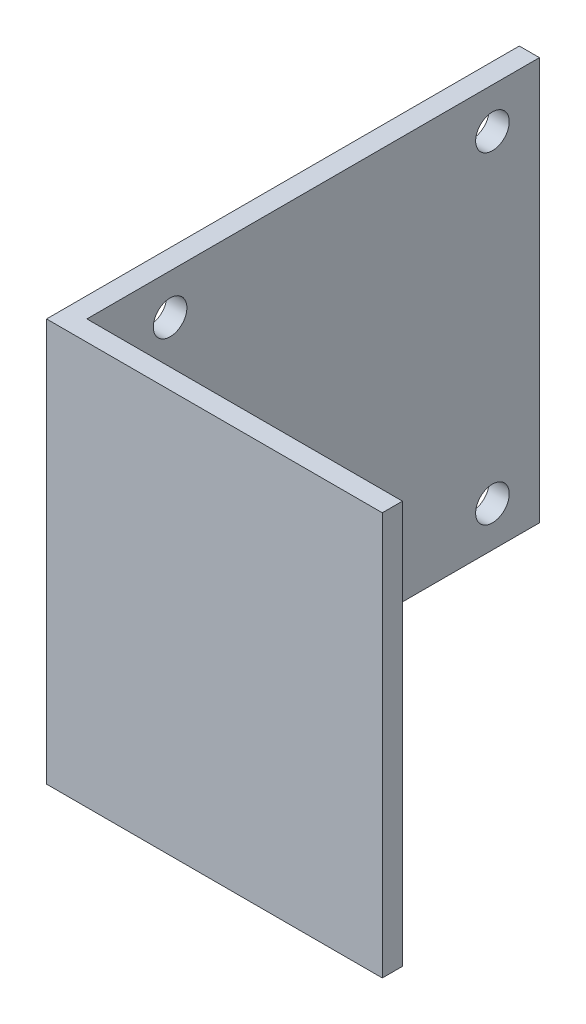
ISO-10303-21;
HEADER;
FILE_DESCRIPTION(('STEP AP214'),'2;1');
FILE_NAME('part.step','',(''),(''),'','','');
FILE_SCHEMA(('AUTOMOTIVE_DESIGN { 1 0 10303 214 1 1 1 1 }'));
ENDSEC;
DATA;
#1=APPLICATION_CONTEXT('core data for automotive mechanical design processes');
#2=APPLICATION_PROTOCOL_DEFINITION('international standard','automotive_design',2000,#1);
#3=PRODUCT_CONTEXT('',#1,'mechanical');
#4=PRODUCT('Part','Part','',(#3));
#5=PRODUCT_RELATED_PRODUCT_CATEGORY('part','',(#4));
#6=PRODUCT_DEFINITION_FORMATION('','',#4);
#7=PRODUCT_DEFINITION_CONTEXT('part definition',#1,'design');
#8=PRODUCT_DEFINITION('design','',#6,#7);
#9=PRODUCT_DEFINITION_SHAPE('','',#8);
#10=(LENGTH_UNIT() NAMED_UNIT(*) SI_UNIT(.MILLI.,.METRE.));
#11=(NAMED_UNIT(*) PLANE_ANGLE_UNIT() SI_UNIT($,.RADIAN.));
#12=(NAMED_UNIT(*) SI_UNIT($,.STERADIAN.) SOLID_ANGLE_UNIT());
#13=UNCERTAINTY_MEASURE_WITH_UNIT(LENGTH_MEASURE(1.E-05),#10,'distance_accuracy_value','');
#14=(GEOMETRIC_REPRESENTATION_CONTEXT(3) GLOBAL_UNCERTAINTY_ASSIGNED_CONTEXT((#13)) GLOBAL_UNIT_ASSIGNED_CONTEXT((#10,
#11,#12)) REPRESENTATION_CONTEXT('',''));
#15=CARTESIAN_POINT('',(0.,0.,0.));
#16=DIRECTION('',(0.,0.,1.));
#17=DIRECTION('',(1.,0.,0.));
#18=AXIS2_PLACEMENT_3D('',#15,#16,#17);
#19=CARTESIAN_POINT('',(50.,60.,0.));
#20=DIRECTION('',(0.,0.,-1.));
#21=DIRECTION('',(-1.,0.,0.));
#22=AXIS2_PLACEMENT_3D('',#19,#20,#21);
#23=PLANE('',#22);
#24=DIRECTION('',(1.,0.,0.));
#25=VECTOR('',#24,1.);
#26=CARTESIAN_POINT('',(50.,0.,0.));
#27=LINE('',#26,#25);
#28=CARTESIAN_POINT('',(0.,0.,0.));
#29=VERTEX_POINT('',#28);
#30=CARTESIAN_POINT('',(50.,0.,0.));
#31=VERTEX_POINT('',#30);
#32=EDGE_CURVE('E128',#29,#31,#27,.T.);
#33=ORIENTED_EDGE('',*,*,#32,.T.);
#34=DIRECTION('',(0.,-1.,0.));
#35=VECTOR('',#34,1.);
#36=CARTESIAN_POINT('',(50.,60.,0.));
#37=LINE('',#36,#35);
#38=CARTESIAN_POINT('',(50.,60.,0.));
#39=VERTEX_POINT('',#38);
#40=EDGE_CURVE('E11',#39,#31,#37,.T.);
#41=ORIENTED_EDGE('',*,*,#40,.F.);
#42=DIRECTION('',(1.,0.,0.));
#43=VECTOR('',#42,1.);
#44=CARTESIAN_POINT('',(50.,60.,0.));
#45=LINE('',#44,#43);
#46=CARTESIAN_POINT('',(0.,60.,0.));
#47=VERTEX_POINT('',#46);
#48=EDGE_CURVE('E145',#47,#39,#45,.T.);
#49=ORIENTED_EDGE('',*,*,#48,.F.);
#50=DIRECTION('',(0.,-1.,0.));
#51=VECTOR('',#50,1.);
#52=CARTESIAN_POINT('',(0.,60.,0.));
#53=LINE('',#52,#51);
#54=EDGE_CURVE('E124',#47,#29,#53,.T.);
#55=ORIENTED_EDGE('',*,*,#54,.T.);
#56=EDGE_LOOP('',(#33,#41,#49,#55));
#57=FACE_BOUND('',#56,.T.);
#58=ADVANCED_FACE('F39',(#57),#23,.F.);
#59=CARTESIAN_POINT('',(50.,60.,-3.));
#60=DIRECTION('',(-1.,0.,0.));
#61=DIRECTION('',(0.,0.,1.));
#62=AXIS2_PLACEMENT_3D('',#59,#60,#61);
#63=PLANE('',#62);
#64=DIRECTION('',(0.,0.,-1.));
#65=VECTOR('',#64,1.);
#66=CARTESIAN_POINT('',(50.,0.,-3.));
#67=LINE('',#66,#65);
#68=CARTESIAN_POINT('',(50.,0.,-3.));
#69=VERTEX_POINT('',#68);
#70=EDGE_CURVE('E132',#31,#69,#67,.T.);
#71=ORIENTED_EDGE('',*,*,#70,.T.);
#72=DIRECTION('',(0.,-1.,0.));
#73=VECTOR('',#72,1.);
#74=CARTESIAN_POINT('',(50.,60.,-3.));
#75=LINE('',#74,#73);
#76=CARTESIAN_POINT('',(50.,60.,-3.));
#77=VERTEX_POINT('',#76);
#78=EDGE_CURVE('E48',#77,#69,#75,.T.);
#79=ORIENTED_EDGE('',*,*,#78,.F.);
#80=DIRECTION('',(0.,0.,-1.));
#81=VECTOR('',#80,1.);
#82=CARTESIAN_POINT('',(50.,60.,-3.));
#83=LINE('',#82,#81);
#84=EDGE_CURVE('E93',#39,#77,#83,.T.);
#85=ORIENTED_EDGE('',*,*,#84,.F.);
#86=ORIENTED_EDGE('',*,*,#40,.T.);
#87=EDGE_LOOP('',(#71,#79,#85,#86));
#88=FACE_BOUND('',#87,.T.);
#89=ADVANCED_FACE('F176',(#88),#63,.F.);
#90=CARTESIAN_POINT('',(3.00000000000001,60.,-3.));
#91=DIRECTION('',(0.,0.,1.));
#92=DIRECTION('',(1.,0.,0.));
#93=AXIS2_PLACEMENT_3D('',#90,#91,#92);
#94=PLANE('',#93);
#95=DIRECTION('',(-1.,0.,0.));
#96=VECTOR('',#95,1.);
#97=CARTESIAN_POINT('',(3.00000000000001,0.,-3.));
#98=LINE('',#97,#96);
#99=CARTESIAN_POINT('',(3.00000000000001,0.,-3.));
#100=VERTEX_POINT('',#99);
#101=EDGE_CURVE('E136',#69,#100,#98,.T.);
#102=ORIENTED_EDGE('',*,*,#101,.T.);
#103=DIRECTION('',(0.,-1.,0.));
#104=VECTOR('',#103,1.);
#105=CARTESIAN_POINT('',(3.00000000000001,60.,-3.));
#106=LINE('',#105,#104);
#107=CARTESIAN_POINT('',(3.00000000000001,60.,-3.));
#108=VERTEX_POINT('',#107);
#109=EDGE_CURVE('E117',#108,#100,#106,.T.);
#110=ORIENTED_EDGE('',*,*,#109,.F.);
#111=DIRECTION('',(-1.,0.,0.));
#112=VECTOR('',#111,1.);
#113=CARTESIAN_POINT('',(3.00000000000001,60.,-3.));
#114=LINE('',#113,#112);
#115=EDGE_CURVE('E106',#77,#108,#114,.T.);
#116=ORIENTED_EDGE('',*,*,#115,.F.);
#117=ORIENTED_EDGE('',*,*,#78,.T.);
#118=EDGE_LOOP('',(#102,#110,#116,#117));
#119=FACE_BOUND('',#118,.T.);
#120=ADVANCED_FACE('F155',(#119),#94,.F.);
#121=CARTESIAN_POINT('',(3.,60.,-70.4));
#122=DIRECTION('',(-1.,0.,0.));
#123=DIRECTION('',(0.,0.,1.));
#124=AXIS2_PLACEMENT_3D('',#121,#122,#123);
#125=PLANE('',#124);
#126=CARTESIAN_POINT('',(3.,54.,-63.4));
#127=DIRECTION('',(-1.,0.,0.));
#128=DIRECTION('',(0.,0.,1.));
#129=AXIS2_PLACEMENT_3D('',#126,#127,#128);
#130=CIRCLE('',#129,2.5);
#131=CARTESIAN_POINT('',(3.,54.,-60.9));
#132=VERTEX_POINT('',#131);
#133=EDGE_CURVE('E133',#132,#132,#130,.T.);
#134=ORIENTED_EDGE('',*,*,#133,.T.);
#135=EDGE_LOOP('',(#134));
#136=FACE_BOUND('',#135,.T.);
#137=CARTESIAN_POINT('',(3.00000000000001,54.,-15.4));
#138=DIRECTION('',(-1.,0.,0.));
#139=DIRECTION('',(0.,0.,1.));
#140=AXIS2_PLACEMENT_3D('',#137,#138,#139);
#141=CIRCLE('',#140,2.5);
#142=CARTESIAN_POINT('',(3.00000000000001,54.,-12.9));
#143=VERTEX_POINT('',#142);
#144=EDGE_CURVE('E195',#143,#143,#141,.T.);
#145=ORIENTED_EDGE('',*,*,#144,.T.);
#146=EDGE_LOOP('',(#145));
#147=FACE_BOUND('',#146,.T.);
#148=CARTESIAN_POINT('',(3.00000000000001,6.,-15.4));
#149=DIRECTION('',(-1.,0.,0.));
#150=DIRECTION('',(0.,0.,1.));
#151=AXIS2_PLACEMENT_3D('',#148,#149,#150);
#152=CIRCLE('',#151,2.5);
#153=CARTESIAN_POINT('',(3.00000000000001,6.,-12.9));
#154=VERTEX_POINT('',#153);
#155=EDGE_CURVE('E199',#154,#154,#152,.T.);
#156=ORIENTED_EDGE('',*,*,#155,.T.);
#157=EDGE_LOOP('',(#156));
#158=FACE_BOUND('',#157,.T.);
#159=CARTESIAN_POINT('',(3.,6.,-63.4));
#160=DIRECTION('',(-1.,0.,0.));
#161=DIRECTION('',(0.,0.,1.));
#162=AXIS2_PLACEMENT_3D('',#159,#160,#161);
#163=CIRCLE('',#162,2.49999999999999);
#164=CARTESIAN_POINT('',(3.,6.,-60.9));
#165=VERTEX_POINT('',#164);
#166=EDGE_CURVE('E202',#165,#165,#163,.T.);
#167=ORIENTED_EDGE('',*,*,#166,.T.);
#168=EDGE_LOOP('',(#167));
#169=FACE_BOUND('',#168,.T.);
#170=DIRECTION('',(0.,0.,-1.));
#171=VECTOR('',#170,1.);
#172=CARTESIAN_POINT('',(3.,0.,-70.4));
#173=LINE('',#172,#171);
#174=CARTESIAN_POINT('',(3.,0.,-70.4));
#175=VERTEX_POINT('',#174);
#176=EDGE_CURVE('E115',#100,#175,#173,.T.);
#177=ORIENTED_EDGE('',*,*,#176,.T.);
#178=DIRECTION('',(0.,-1.,0.));
#179=VECTOR('',#178,1.);
#180=CARTESIAN_POINT('',(3.,60.,-70.4));
#181=LINE('',#180,#179);
#182=CARTESIAN_POINT('',(3.,60.,-70.4));
#183=VERTEX_POINT('',#182);
#184=EDGE_CURVE('E112',#183,#175,#181,.T.);
#185=ORIENTED_EDGE('',*,*,#184,.F.);
#186=DIRECTION('',(0.,0.,-1.));
#187=VECTOR('',#186,1.);
#188=CARTESIAN_POINT('',(3.,60.,-70.4));
#189=LINE('',#188,#187);
#190=EDGE_CURVE('E100',#108,#183,#189,.T.);
#191=ORIENTED_EDGE('',*,*,#190,.F.);
#192=ORIENTED_EDGE('',*,*,#109,.T.);
#193=EDGE_LOOP('',(#177,#185,#191,#192));
#194=FACE_BOUND('',#193,.T.);
#195=ADVANCED_FACE('F113',(#136,#147,#158,#169,#194),#125,.F.);
#196=CARTESIAN_POINT('',(0.,60.,-70.4));
#197=DIRECTION('',(0.,0.,1.));
#198=DIRECTION('',(1.,0.,0.));
#199=AXIS2_PLACEMENT_3D('',#196,#197,#198);
#200=PLANE('',#199);
#201=DIRECTION('',(-1.,0.,0.));
#202=VECTOR('',#201,1.);
#203=CARTESIAN_POINT('',(0.,0.,-70.4));
#204=LINE('',#203,#202);
#205=CARTESIAN_POINT('',(0.,0.,-70.4));
#206=VERTEX_POINT('',#205);
#207=EDGE_CURVE('E79',#175,#206,#204,.T.);
#208=ORIENTED_EDGE('',*,*,#207,.T.);
#209=DIRECTION('',(0.,-1.,0.));
#210=VECTOR('',#209,1.);
#211=CARTESIAN_POINT('',(0.,60.,-70.4));
#212=LINE('',#211,#210);
#213=CARTESIAN_POINT('',(0.,60.,-70.4));
#214=VERTEX_POINT('',#213);
#215=EDGE_CURVE('E118',#214,#206,#212,.T.);
#216=ORIENTED_EDGE('',*,*,#215,.F.);
#217=DIRECTION('',(-1.,0.,0.));
#218=VECTOR('',#217,1.);
#219=CARTESIAN_POINT('',(0.,60.,-70.4));
#220=LINE('',#219,#218);
#221=EDGE_CURVE('E104',#183,#214,#220,.T.);
#222=ORIENTED_EDGE('',*,*,#221,.F.);
#223=ORIENTED_EDGE('',*,*,#184,.T.);
#224=EDGE_LOOP('',(#208,#216,#222,#223));
#225=FACE_BOUND('',#224,.T.);
#226=ADVANCED_FACE('F120',(#225),#200,.F.);
#227=CARTESIAN_POINT('',(0.,60.,0.));
#228=DIRECTION('',(1.,0.,0.));
#229=DIRECTION('',(0.,0.,-1.));
#230=AXIS2_PLACEMENT_3D('',#227,#228,#229);
#231=PLANE('',#230);
#232=CARTESIAN_POINT('',(0.,54.,-63.4));
#233=DIRECTION('',(-1.,0.,0.));
#234=DIRECTION('',(0.,0.,-1.));
#235=AXIS2_PLACEMENT_3D('',#232,#233,#234);
#236=CIRCLE('',#235,2.5);
#237=CARTESIAN_POINT('',(0.,54.,-65.9));
#238=VERTEX_POINT('',#237);
#239=EDGE_CURVE('E223',#238,#238,#236,.T.);
#240=ORIENTED_EDGE('',*,*,#239,.F.);
#241=EDGE_LOOP('',(#240));
#242=FACE_BOUND('',#241,.T.);
#243=CARTESIAN_POINT('',(0.,54.,-15.4));
#244=DIRECTION('',(-1.,0.,0.));
#245=DIRECTION('',(0.,0.,-1.));
#246=AXIS2_PLACEMENT_3D('',#243,#244,#245);
#247=CIRCLE('',#246,2.5);
#248=CARTESIAN_POINT('',(0.,54.,-17.9));
#249=VERTEX_POINT('',#248);
#250=EDGE_CURVE('E227',#249,#249,#247,.T.);
#251=ORIENTED_EDGE('',*,*,#250,.F.);
#252=EDGE_LOOP('',(#251));
#253=FACE_BOUND('',#252,.T.);
#254=CARTESIAN_POINT('',(0.,6.,-15.4));
#255=DIRECTION('',(-1.,0.,0.));
#256=DIRECTION('',(0.,0.,1.));
#257=AXIS2_PLACEMENT_3D('',#254,#255,#256);
#258=CIRCLE('',#257,2.5);
#259=CARTESIAN_POINT('',(0.,6.,-12.9));
#260=VERTEX_POINT('',#259);
#261=EDGE_CURVE('E211',#260,#260,#258,.T.);
#262=ORIENTED_EDGE('',*,*,#261,.F.);
#263=EDGE_LOOP('',(#262));
#264=FACE_BOUND('',#263,.T.);
#265=CARTESIAN_POINT('',(0.,6.,-63.4));
#266=DIRECTION('',(-1.,0.,0.));
#267=DIRECTION('',(0.,0.,1.));
#268=AXIS2_PLACEMENT_3D('',#265,#266,#267);
#269=CIRCLE('',#268,2.49999999999999);
#270=CARTESIAN_POINT('',(0.,6.,-60.9));
#271=VERTEX_POINT('',#270);
#272=EDGE_CURVE('E205',#271,#271,#269,.T.);
#273=ORIENTED_EDGE('',*,*,#272,.F.);
#274=EDGE_LOOP('',(#273));
#275=FACE_BOUND('',#274,.T.);
#276=DIRECTION('',(0.,0.,1.));
#277=VECTOR('',#276,1.);
#278=CARTESIAN_POINT('',(0.,0.,0.));
#279=LINE('',#278,#277);
#280=EDGE_CURVE('E85',#206,#29,#279,.T.);
#281=ORIENTED_EDGE('',*,*,#280,.T.);
#282=ORIENTED_EDGE('',*,*,#54,.F.);
#283=DIRECTION('',(0.,0.,1.));
#284=VECTOR('',#283,1.);
#285=CARTESIAN_POINT('',(0.,60.,0.));
#286=LINE('',#285,#284);
#287=EDGE_CURVE('E56',#214,#47,#286,.T.);
#288=ORIENTED_EDGE('',*,*,#287,.F.);
#289=ORIENTED_EDGE('',*,*,#215,.T.);
#290=EDGE_LOOP('',(#281,#282,#288,#289));
#291=FACE_BOUND('',#290,.T.);
#292=ADVANCED_FACE('F162',(#242,#253,#264,#275,#291),#231,.F.);
#293=CARTESIAN_POINT('',(0.,60.,0.));
#294=DIRECTION('',(0.,-1.,0.));
#295=DIRECTION('',(0.,0.,-1.));
#296=AXIS2_PLACEMENT_3D('',#293,#294,#295);
#297=PLANE('',#296);
#298=ORIENTED_EDGE('',*,*,#48,.T.);
#299=ORIENTED_EDGE('',*,*,#84,.T.);
#300=ORIENTED_EDGE('',*,*,#115,.T.);
#301=ORIENTED_EDGE('',*,*,#190,.T.);
#302=ORIENTED_EDGE('',*,*,#221,.T.);
#303=ORIENTED_EDGE('',*,*,#287,.T.);
#304=EDGE_LOOP('',(#298,#299,#300,#301,#302,#303));
#305=FACE_BOUND('',#304,.T.);
#306=ADVANCED_FACE('F102',(#305),#297,.F.);
#307=CARTESIAN_POINT('',(0.,0.,0.));
#308=DIRECTION('',(0.,-1.,0.));
#309=DIRECTION('',(0.,0.,-1.));
#310=AXIS2_PLACEMENT_3D('',#307,#308,#309);
#311=PLANE('',#310);
#312=ORIENTED_EDGE('',*,*,#32,.F.);
#313=ORIENTED_EDGE('',*,*,#280,.F.);
#314=ORIENTED_EDGE('',*,*,#207,.F.);
#315=ORIENTED_EDGE('',*,*,#176,.F.);
#316=ORIENTED_EDGE('',*,*,#101,.F.);
#317=ORIENTED_EDGE('',*,*,#70,.F.);
#318=EDGE_LOOP('',(#312,#313,#314,#315,#316,#317));
#319=FACE_BOUND('',#318,.T.);
#320=ADVANCED_FACE('F158',(#319),#311,.T.);
#321=CARTESIAN_POINT('',(50.,6.,-63.4));
#322=DIRECTION('',(-1.,0.,0.));
#323=DIRECTION('',(0.,0.,1.));
#324=AXIS2_PLACEMENT_3D('',#321,#322,#323);
#325=CYLINDRICAL_SURFACE('',#324,2.49999999999999);
#326=ORIENTED_EDGE('',*,*,#272,.T.);
#327=EDGE_LOOP('',(#326));
#328=FACE_BOUND('',#327,.T.);
#329=ORIENTED_EDGE('',*,*,#166,.F.);
#330=EDGE_LOOP('',(#329));
#331=FACE_BOUND('',#330,.T.);
#332=ADVANCED_FACE('F241',(#328,#331),#325,.F.);
#333=CARTESIAN_POINT('',(50.,6.,-15.4));
#334=DIRECTION('',(-1.,0.,0.));
#335=DIRECTION('',(0.,0.,1.));
#336=AXIS2_PLACEMENT_3D('',#333,#334,#335);
#337=CYLINDRICAL_SURFACE('',#336,2.5);
#338=ORIENTED_EDGE('',*,*,#261,.T.);
#339=EDGE_LOOP('',(#338));
#340=FACE_BOUND('',#339,.T.);
#341=ORIENTED_EDGE('',*,*,#155,.F.);
#342=EDGE_LOOP('',(#341));
#343=FACE_BOUND('',#342,.T.);
#344=ADVANCED_FACE('F235',(#340,#343),#337,.F.);
#345=CARTESIAN_POINT('',(50.,54.,-15.4));
#346=DIRECTION('',(-1.,0.,0.));
#347=DIRECTION('',(0.,0.,1.));
#348=AXIS2_PLACEMENT_3D('',#345,#346,#347);
#349=CYLINDRICAL_SURFACE('',#348,2.5);
#350=ORIENTED_EDGE('',*,*,#250,.T.);
#351=EDGE_LOOP('',(#350));
#352=FACE_BOUND('',#351,.T.);
#353=ORIENTED_EDGE('',*,*,#144,.F.);
#354=EDGE_LOOP('',(#353));
#355=FACE_BOUND('',#354,.T.);
#356=ADVANCED_FACE('F248',(#352,#355),#349,.F.);
#357=CARTESIAN_POINT('',(50.,54.,-63.4));
#358=DIRECTION('',(-1.,0.,0.));
#359=DIRECTION('',(0.,0.,1.));
#360=AXIS2_PLACEMENT_3D('',#357,#358,#359);
#361=CYLINDRICAL_SURFACE('',#360,2.5);
#362=ORIENTED_EDGE('',*,*,#239,.T.);
#363=EDGE_LOOP('',(#362));
#364=FACE_BOUND('',#363,.T.);
#365=ORIENTED_EDGE('',*,*,#133,.F.);
#366=EDGE_LOOP('',(#365));
#367=FACE_BOUND('',#366,.T.);
#368=ADVANCED_FACE('F251',(#364,#367),#361,.F.);
#369=CLOSED_SHELL('',(#58,#89,#120,#195,#226,#292,#306,#320,#332,#344,#356,#368));
#370=MANIFOLD_SOLID_BREP('B2',#369);
#371=ADVANCED_BREP_SHAPE_REPRESENTATION('',(#18,#370),#14);
#372=SHAPE_DEFINITION_REPRESENTATION(#9,#371);
ENDSEC;
END-ISO-10303-21;
